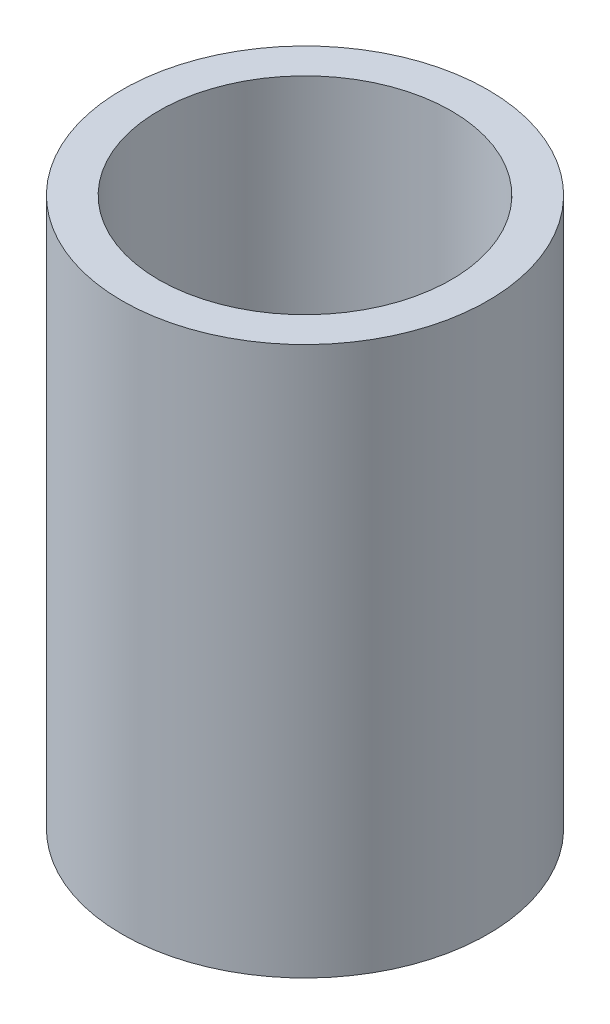
ISO-10303-21;
HEADER;
FILE_DESCRIPTION(('STEP AP214'),'2;1');
FILE_NAME('part.step','',(''),(''),'','','');
FILE_SCHEMA(('AUTOMOTIVE_DESIGN { 1 0 10303 214 1 1 1 1 }'));
ENDSEC;
DATA;
#1=APPLICATION_CONTEXT('core data for automotive mechanical design processes');
#2=APPLICATION_PROTOCOL_DEFINITION('international standard','automotive_design',2000,#1);
#3=PRODUCT_CONTEXT('',#1,'mechanical');
#4=PRODUCT('Part','Part','',(#3));
#5=PRODUCT_RELATED_PRODUCT_CATEGORY('part','',(#4));
#6=PRODUCT_DEFINITION_FORMATION('','',#4);
#7=PRODUCT_DEFINITION_CONTEXT('part definition',#1,'design');
#8=PRODUCT_DEFINITION('design','',#6,#7);
#9=PRODUCT_DEFINITION_SHAPE('','',#8);
#10=(LENGTH_UNIT() NAMED_UNIT(*) SI_UNIT(.MILLI.,.METRE.));
#11=(NAMED_UNIT(*) PLANE_ANGLE_UNIT() SI_UNIT($,.RADIAN.));
#12=(NAMED_UNIT(*) SI_UNIT($,.STERADIAN.) SOLID_ANGLE_UNIT());
#13=UNCERTAINTY_MEASURE_WITH_UNIT(LENGTH_MEASURE(1.E-05),#10,'distance_accuracy_value','');
#14=(GEOMETRIC_REPRESENTATION_CONTEXT(3) GLOBAL_UNCERTAINTY_ASSIGNED_CONTEXT((#13)) GLOBAL_UNIT_ASSIGNED_CONTEXT((#10,
#11,#12)) REPRESENTATION_CONTEXT('',''));
#15=CARTESIAN_POINT('',(0.,0.,0.));
#16=DIRECTION('',(0.,0.,1.));
#17=DIRECTION('',(1.,0.,0.));
#18=AXIS2_PLACEMENT_3D('',#15,#16,#17);
#19=CARTESIAN_POINT('',(0.,150.,0.));
#20=DIRECTION('',(0.,1.,0.));
#21=DIRECTION('',(0.,0.,1.));
#22=AXIS2_PLACEMENT_3D('',#19,#20,#21);
#23=PLANE('',#22);
#24=CARTESIAN_POINT('',(0.,150.,0.));
#25=DIRECTION('',(0.,1.,0.));
#26=DIRECTION('',(0.,0.,1.));
#27=AXIS2_PLACEMENT_3D('',#24,#25,#26);
#28=CIRCLE('',#27,50.);
#29=CARTESIAN_POINT('',(0.,150.,50.));
#30=VERTEX_POINT('',#29);
#31=EDGE_CURVE('E10',#30,#30,#28,.T.);
#32=ORIENTED_EDGE('',*,*,#31,.T.);
#33=EDGE_LOOP('',(#32));
#34=FACE_BOUND('',#33,.T.);
#35=CARTESIAN_POINT('',(0.,150.,0.));
#36=DIRECTION('',(0.,1.,0.));
#37=DIRECTION('',(0.,0.,1.));
#38=AXIS2_PLACEMENT_3D('',#35,#36,#37);
#39=CIRCLE('',#38,40.);
#40=CARTESIAN_POINT('',(0.,150.,40.));
#41=VERTEX_POINT('',#40);
#42=EDGE_CURVE('E52',#41,#41,#39,.T.);
#43=ORIENTED_EDGE('',*,*,#42,.F.);
#44=EDGE_LOOP('',(#43));
#45=FACE_BOUND('',#44,.T.);
#46=ADVANCED_FACE('F41',(#34,#45),#23,.T.);
#47=CARTESIAN_POINT('',(0.,0.,0.));
#48=DIRECTION('',(0.,1.,0.));
#49=DIRECTION('',(0.,0.,1.));
#50=AXIS2_PLACEMENT_3D('',#47,#48,#49);
#51=PLANE('',#50);
#52=CARTESIAN_POINT('',(0.,0.,0.));
#53=DIRECTION('',(0.,1.,0.));
#54=DIRECTION('',(0.,0.,1.));
#55=AXIS2_PLACEMENT_3D('',#52,#53,#54);
#56=CIRCLE('',#55,50.);
#57=CARTESIAN_POINT('',(0.,0.,50.));
#58=VERTEX_POINT('',#57);
#59=EDGE_CURVE('E45',#58,#58,#56,.T.);
#60=ORIENTED_EDGE('',*,*,#59,.F.);
#61=EDGE_LOOP('',(#60));
#62=FACE_BOUND('',#61,.T.);
#63=CARTESIAN_POINT('',(0.,0.,0.));
#64=DIRECTION('',(0.,1.,0.));
#65=DIRECTION('',(0.,0.,1.));
#66=AXIS2_PLACEMENT_3D('',#63,#64,#65);
#67=CIRCLE('',#66,40.);
#68=CARTESIAN_POINT('',(0.,0.,40.));
#69=VERTEX_POINT('',#68);
#70=EDGE_CURVE('E54',#69,#69,#67,.T.);
#71=ORIENTED_EDGE('',*,*,#70,.T.);
#72=EDGE_LOOP('',(#71));
#73=FACE_BOUND('',#72,.T.);
#74=ADVANCED_FACE('F64',(#62,#73),#51,.F.);
#75=CARTESIAN_POINT('',(0.,150.,0.));
#76=DIRECTION('',(0.,-1.,0.));
#77=DIRECTION('',(0.,0.,-1.));
#78=AXIS2_PLACEMENT_3D('',#75,#76,#77);
#79=CYLINDRICAL_SURFACE('',#78,50.);
#80=ORIENTED_EDGE('',*,*,#31,.F.);
#81=EDGE_LOOP('',(#80));
#82=FACE_BOUND('',#81,.T.);
#83=ORIENTED_EDGE('',*,*,#59,.T.);
#84=EDGE_LOOP('',(#83));
#85=FACE_BOUND('',#84,.T.);
#86=ADVANCED_FACE('F43',(#82,#85),#79,.T.);
#87=CARTESIAN_POINT('',(0.,150.,0.));
#88=DIRECTION('',(0.,-1.,0.));
#89=DIRECTION('',(0.,0.,-1.));
#90=AXIS2_PLACEMENT_3D('',#87,#88,#89);
#91=CYLINDRICAL_SURFACE('',#90,40.);
#92=ORIENTED_EDGE('',*,*,#42,.T.);
#93=EDGE_LOOP('',(#92));
#94=FACE_BOUND('',#93,.T.);
#95=ORIENTED_EDGE('',*,*,#70,.F.);
#96=EDGE_LOOP('',(#95));
#97=FACE_BOUND('',#96,.T.);
#98=ADVANCED_FACE('F60',(#94,#97),#91,.F.);
#99=CLOSED_SHELL('',(#46,#74,#86,#98));
#100=MANIFOLD_SOLID_BREP('B2',#99);
#101=ADVANCED_BREP_SHAPE_REPRESENTATION('',(#18,#100),#14);
#102=SHAPE_DEFINITION_REPRESENTATION(#9,#101);
ENDSEC;
END-ISO-10303-21;
